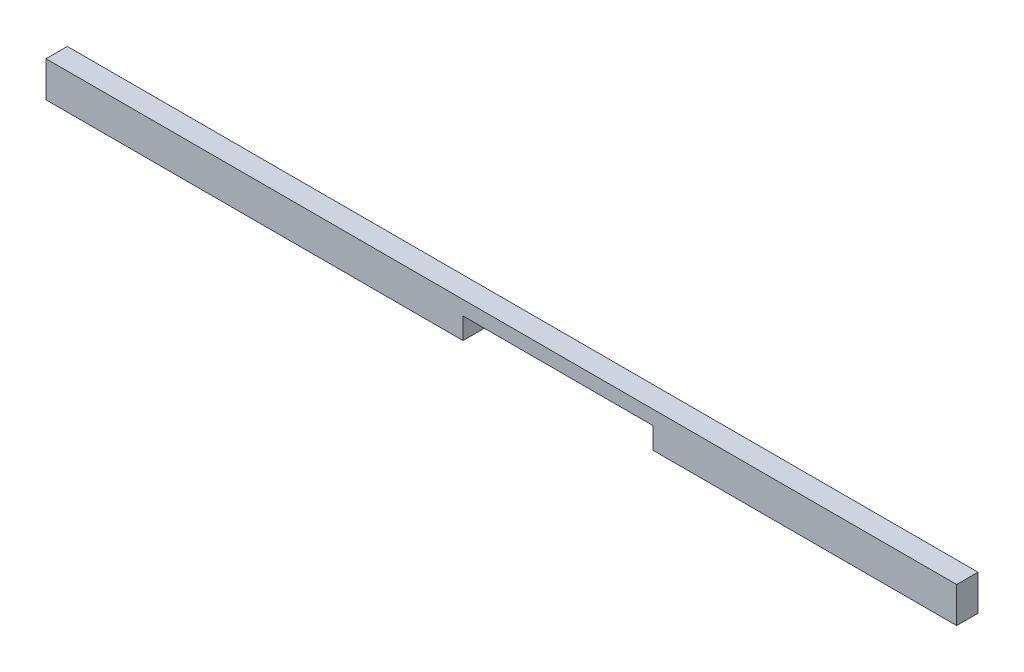
ISO-10303-21;
HEADER;
FILE_DESCRIPTION(('STEP AP214'),'2;1');
FILE_NAME('part.step','',(''),(''),'','','');
FILE_SCHEMA(('AUTOMOTIVE_DESIGN { 1 0 10303 214 1 1 1 1 }'));
ENDSEC;
DATA;
#1=APPLICATION_CONTEXT('core data for automotive mechanical design processes');
#2=APPLICATION_PROTOCOL_DEFINITION('international standard','automotive_design',2000,#1);
#3=PRODUCT_CONTEXT('',#1,'mechanical');
#4=PRODUCT('Part','Part','',(#3));
#5=PRODUCT_RELATED_PRODUCT_CATEGORY('part','',(#4));
#6=PRODUCT_DEFINITION_FORMATION('','',#4);
#7=PRODUCT_DEFINITION_CONTEXT('part definition',#1,'design');
#8=PRODUCT_DEFINITION('design','',#6,#7);
#9=PRODUCT_DEFINITION_SHAPE('','',#8);
#10=(LENGTH_UNIT() NAMED_UNIT(*) SI_UNIT(.MILLI.,.METRE.));
#11=(NAMED_UNIT(*) PLANE_ANGLE_UNIT() SI_UNIT($,.RADIAN.));
#12=(NAMED_UNIT(*) SI_UNIT($,.STERADIAN.) SOLID_ANGLE_UNIT());
#13=UNCERTAINTY_MEASURE_WITH_UNIT(LENGTH_MEASURE(1.E-05),#10,'distance_accuracy_value','');
#14=(GEOMETRIC_REPRESENTATION_CONTEXT(3) GLOBAL_UNCERTAINTY_ASSIGNED_CONTEXT((#13)) GLOBAL_UNIT_ASSIGNED_CONTEXT((#10,
#11,#12)) REPRESENTATION_CONTEXT('',''));
#15=CARTESIAN_POINT('',(0.,0.,0.));
#16=DIRECTION('',(0.,0.,1.));
#17=DIRECTION('',(1.,0.,0.));
#18=AXIS2_PLACEMENT_3D('',#15,#16,#17);
#19=CARTESIAN_POINT('',(0.,0.,0.));
#20=DIRECTION('',(0.,-1.,0.));
#21=DIRECTION('',(0.,0.,-1.));
#22=AXIS2_PLACEMENT_3D('',#19,#20,#21);
#23=PLANE('',#22);
#24=DIRECTION('',(0.,0.,-1.));
#25=VECTOR('',#24,1.);
#26=CARTESIAN_POINT('',(-34.1824934363978,0.,9.525));
#27=LINE('',#26,#25);
#28=CARTESIAN_POINT('',(-34.1824934363978,0.,9.525));
#29=VERTEX_POINT('',#28);
#30=CARTESIAN_POINT('',(-34.1824934363978,0.,-9.525));
#31=VERTEX_POINT('',#30);
#32=EDGE_CURVE('E138',#29,#31,#27,.T.);
#33=ORIENTED_EDGE('',*,*,#32,.F.);
#34=DIRECTION('',(1.,0.,0.));
#35=VECTOR('',#34,1.);
#36=CARTESIAN_POINT('',(-406.4,0.,9.525));
#37=LINE('',#36,#35);
#38=CARTESIAN_POINT('',(-406.4,0.,9.525));
#39=VERTEX_POINT('',#38);
#40=EDGE_CURVE('E130',#39,#29,#37,.T.);
#41=ORIENTED_EDGE('',*,*,#40,.F.);
#42=DIRECTION('',(0.,0.,1.));
#43=VECTOR('',#42,1.);
#44=CARTESIAN_POINT('',(-406.4,0.,9.525));
#45=LINE('',#44,#43);
#46=CARTESIAN_POINT('',(-406.4,0.,-9.525));
#47=VERTEX_POINT('',#46);
#48=EDGE_CURVE('E157',#47,#39,#45,.T.);
#49=ORIENTED_EDGE('',*,*,#48,.F.);
#50=DIRECTION('',(-1.,0.,0.));
#51=VECTOR('',#50,1.);
#52=CARTESIAN_POINT('',(-406.4,0.,-9.525));
#53=LINE('',#52,#51);
#54=EDGE_CURVE('E153',#31,#47,#53,.T.);
#55=ORIENTED_EDGE('',*,*,#54,.F.);
#56=EDGE_LOOP('',(#33,#41,#49,#55));
#57=FACE_BOUND('',#56,.T.);
#58=ADVANCED_FACE('F34',(#57),#23,.T.);
#59=CARTESIAN_POINT('',(406.4,31.75,9.525));
#60=DIRECTION('',(-1.,0.,0.));
#61=DIRECTION('',(0.,0.,1.));
#62=AXIS2_PLACEMENT_3D('',#59,#60,#61);
#63=PLANE('',#62);
#64=DIRECTION('',(0.,0.,-1.));
#65=VECTOR('',#64,1.);
#66=CARTESIAN_POINT('',(406.4,0.,9.525));
#67=LINE('',#66,#65);
#68=CARTESIAN_POINT('',(406.4,0.,9.525));
#69=VERTEX_POINT('',#68);
#70=CARTESIAN_POINT('',(406.4,0.,-9.525));
#71=VERTEX_POINT('',#70);
#72=EDGE_CURVE('E140',#69,#71,#67,.T.);
#73=ORIENTED_EDGE('',*,*,#72,.T.);
#74=DIRECTION('',(0.,-1.,0.));
#75=VECTOR('',#74,1.);
#76=CARTESIAN_POINT('',(406.4,31.75,-9.525));
#77=LINE('',#76,#75);
#78=CARTESIAN_POINT('',(406.4,31.75,-9.525));
#79=VERTEX_POINT('',#78);
#80=EDGE_CURVE('E11',#79,#71,#77,.T.);
#81=ORIENTED_EDGE('',*,*,#80,.F.);
#82=DIRECTION('',(0.,0.,-1.));
#83=VECTOR('',#82,1.);
#84=CARTESIAN_POINT('',(406.4,31.75,9.525));
#85=LINE('',#84,#83);
#86=CARTESIAN_POINT('',(406.4,31.75,9.525));
#87=VERTEX_POINT('',#86);
#88=EDGE_CURVE('E144',#87,#79,#85,.T.);
#89=ORIENTED_EDGE('',*,*,#88,.F.);
#90=DIRECTION('',(0.,-1.,0.));
#91=VECTOR('',#90,1.);
#92=CARTESIAN_POINT('',(406.4,31.75,9.525));
#93=LINE('',#92,#91);
#94=EDGE_CURVE('E150',#87,#69,#93,.T.);
#95=ORIENTED_EDGE('',*,*,#94,.T.);
#96=EDGE_LOOP('',(#73,#81,#89,#95));
#97=FACE_BOUND('',#96,.T.);
#98=ADVANCED_FACE('F36',(#97),#63,.F.);
#99=CARTESIAN_POINT('',(-406.4,31.75,-9.525));
#100=DIRECTION('',(0.,0.,1.));
#101=DIRECTION('',(1.,0.,0.));
#102=AXIS2_PLACEMENT_3D('',#99,#100,#101);
#103=PLANE('',#102);
#104=DIRECTION('',(1.,0.,0.));
#105=VECTOR('',#104,1.);
#106=CARTESIAN_POINT('',(-34.1824934363978,19.05,-9.525));
#107=LINE('',#106,#105);
#108=CARTESIAN_POINT('',(-34.1824934363978,19.05,-9.525));
#109=VERTEX_POINT('',#108);
#110=CARTESIAN_POINT('',(135.206139415608,19.05,-9.525));
#111=VERTEX_POINT('',#110);
#112=EDGE_CURVE('E132',#109,#111,#107,.T.);
#113=ORIENTED_EDGE('',*,*,#112,.F.);
#114=DIRECTION('',(0.,1.,0.));
#115=VECTOR('',#114,1.);
#116=CARTESIAN_POINT('',(-34.1824934363978,0.,-9.525));
#117=LINE('',#116,#115);
#118=EDGE_CURVE('E114',#31,#109,#117,.T.);
#119=ORIENTED_EDGE('',*,*,#118,.F.);
#120=ORIENTED_EDGE('',*,*,#54,.T.);
#121=DIRECTION('',(0.,-1.,0.));
#122=VECTOR('',#121,1.);
#123=CARTESIAN_POINT('',(-406.4,31.75,-9.525));
#124=LINE('',#123,#122);
#125=CARTESIAN_POINT('',(-406.4,31.75,-9.525));
#126=VERTEX_POINT('',#125);
#127=EDGE_CURVE('E42',#126,#47,#124,.T.);
#128=ORIENTED_EDGE('',*,*,#127,.F.);
#129=DIRECTION('',(-1.,0.,0.));
#130=VECTOR('',#129,1.);
#131=CARTESIAN_POINT('',(-406.4,31.75,-9.525));
#132=LINE('',#131,#130);
#133=EDGE_CURVE('E86',#79,#126,#132,.T.);
#134=ORIENTED_EDGE('',*,*,#133,.F.);
#135=ORIENTED_EDGE('',*,*,#80,.T.);
#136=CARTESIAN_POINT('',(135.206139415608,0.,-9.525));
#137=VERTEX_POINT('',#136);
#138=EDGE_CURVE('E154',#71,#137,#53,.T.);
#139=ORIENTED_EDGE('',*,*,#138,.T.);
#140=DIRECTION('',(0.,-1.,0.));
#141=VECTOR('',#140,1.);
#142=CARTESIAN_POINT('',(135.206139415608,19.05,-9.525));
#143=LINE('',#142,#141);
#144=EDGE_CURVE('E49',#111,#137,#143,.T.);
#145=ORIENTED_EDGE('',*,*,#144,.F.);
#146=EDGE_LOOP('',(#113,#119,#120,#128,#134,#135,#139,#145));
#147=FACE_BOUND('',#146,.T.);
#148=ADVANCED_FACE('F170',(#147),#103,.F.);
#149=CARTESIAN_POINT('',(-406.4,31.75,9.525));
#150=DIRECTION('',(1.,0.,0.));
#151=DIRECTION('',(0.,0.,-1.));
#152=AXIS2_PLACEMENT_3D('',#149,#150,#151);
#153=PLANE('',#152);
#154=ORIENTED_EDGE('',*,*,#48,.T.);
#155=DIRECTION('',(0.,-1.,0.));
#156=VECTOR('',#155,1.);
#157=CARTESIAN_POINT('',(-406.4,31.75,9.525));
#158=LINE('',#157,#156);
#159=CARTESIAN_POINT('',(-406.4,31.75,9.525));
#160=VERTEX_POINT('',#159);
#161=EDGE_CURVE('E161',#160,#39,#158,.T.);
#162=ORIENTED_EDGE('',*,*,#161,.F.);
#163=DIRECTION('',(0.,0.,1.));
#164=VECTOR('',#163,1.);
#165=CARTESIAN_POINT('',(-406.4,31.75,9.525));
#166=LINE('',#165,#164);
#167=EDGE_CURVE('E147',#126,#160,#166,.T.);
#168=ORIENTED_EDGE('',*,*,#167,.F.);
#169=ORIENTED_EDGE('',*,*,#127,.T.);
#170=EDGE_LOOP('',(#154,#162,#168,#169));
#171=FACE_BOUND('',#170,.T.);
#172=ADVANCED_FACE('F166',(#171),#153,.F.);
#173=CARTESIAN_POINT('',(-406.4,31.75,9.525));
#174=DIRECTION('',(0.,0.,-1.));
#175=DIRECTION('',(-1.,0.,0.));
#176=AXIS2_PLACEMENT_3D('',#173,#174,#175);
#177=PLANE('',#176);
#178=ORIENTED_EDGE('',*,*,#40,.T.);
#179=DIRECTION('',(0.,1.,0.));
#180=VECTOR('',#179,1.);
#181=CARTESIAN_POINT('',(-34.1824934363978,0.,9.525));
#182=LINE('',#181,#180);
#183=CARTESIAN_POINT('',(-34.1824934363978,19.05,9.525));
#184=VERTEX_POINT('',#183);
#185=EDGE_CURVE('E111',#29,#184,#182,.T.);
#186=ORIENTED_EDGE('',*,*,#185,.T.);
#187=DIRECTION('',(1.,0.,0.));
#188=VECTOR('',#187,1.);
#189=CARTESIAN_POINT('',(-34.1824934363978,19.05,9.525));
#190=LINE('',#189,#188);
#191=CARTESIAN_POINT('',(135.206139415608,19.05,9.525));
#192=VERTEX_POINT('',#191);
#193=EDGE_CURVE('E122',#184,#192,#190,.T.);
#194=ORIENTED_EDGE('',*,*,#193,.T.);
#195=DIRECTION('',(0.,-1.,0.));
#196=VECTOR('',#195,1.);
#197=CARTESIAN_POINT('',(135.206139415608,19.05,9.525));
#198=LINE('',#197,#196);
#199=CARTESIAN_POINT('',(135.206139415608,0.,9.525));
#200=VERTEX_POINT('',#199);
#201=EDGE_CURVE('E119',#192,#200,#198,.T.);
#202=ORIENTED_EDGE('',*,*,#201,.T.);
#203=EDGE_CURVE('E79',#200,#69,#37,.T.);
#204=ORIENTED_EDGE('',*,*,#203,.T.);
#205=ORIENTED_EDGE('',*,*,#94,.F.);
#206=DIRECTION('',(1.,0.,0.));
#207=VECTOR('',#206,1.);
#208=CARTESIAN_POINT('',(-406.4,31.75,9.525));
#209=LINE('',#208,#207);
#210=EDGE_CURVE('E58',#160,#87,#209,.T.);
#211=ORIENTED_EDGE('',*,*,#210,.F.);
#212=ORIENTED_EDGE('',*,*,#161,.T.);
#213=EDGE_LOOP('',(#178,#186,#194,#202,#204,#205,#211,#212));
#214=FACE_BOUND('',#213,.T.);
#215=ADVANCED_FACE('F127',(#214),#177,.F.);
#216=CARTESIAN_POINT('',(0.,31.75,0.));
#217=DIRECTION('',(0.,-1.,0.));
#218=DIRECTION('',(0.,0.,-1.));
#219=AXIS2_PLACEMENT_3D('',#216,#217,#218);
#220=PLANE('',#219);
#221=ORIENTED_EDGE('',*,*,#88,.T.);
#222=ORIENTED_EDGE('',*,*,#133,.T.);
#223=ORIENTED_EDGE('',*,*,#167,.T.);
#224=ORIENTED_EDGE('',*,*,#210,.T.);
#225=EDGE_LOOP('',(#221,#222,#223,#224));
#226=FACE_BOUND('',#225,.T.);
#227=ADVANCED_FACE('F193',(#226),#220,.F.);
#228=DIRECTION('',(0.,0.,-1.));
#229=VECTOR('',#228,1.);
#230=CARTESIAN_POINT('',(135.206139415608,0.,9.525));
#231=LINE('',#230,#229);
#232=EDGE_CURVE('E141',#200,#137,#231,.T.);
#233=ORIENTED_EDGE('',*,*,#232,.T.);
#234=ORIENTED_EDGE('',*,*,#138,.F.);
#235=ORIENTED_EDGE('',*,*,#72,.F.);
#236=ORIENTED_EDGE('',*,*,#203,.F.);
#237=EDGE_LOOP('',(#233,#234,#235,#236));
#238=FACE_BOUND('',#237,.T.);
#239=ADVANCED_FACE('F174',(#238),#23,.T.);
#240=CARTESIAN_POINT('',(-34.1824934363978,0.,9.525));
#241=DIRECTION('',(-1.,0.,0.));
#242=DIRECTION('',(0.,0.,1.));
#243=AXIS2_PLACEMENT_3D('',#240,#241,#242);
#244=PLANE('',#243);
#245=ORIENTED_EDGE('',*,*,#118,.T.);
#246=DIRECTION('',(0.,0.,-1.));
#247=VECTOR('',#246,1.);
#248=CARTESIAN_POINT('',(-34.1824934363978,19.05,9.525));
#249=LINE('',#248,#247);
#250=EDGE_CURVE('E107',#184,#109,#249,.T.);
#251=ORIENTED_EDGE('',*,*,#250,.F.);
#252=ORIENTED_EDGE('',*,*,#185,.F.);
#253=ORIENTED_EDGE('',*,*,#32,.T.);
#254=EDGE_LOOP('',(#245,#251,#252,#253));
#255=FACE_BOUND('',#254,.T.);
#256=ADVANCED_FACE('F109',(#255),#244,.F.);
#257=CARTESIAN_POINT('',(135.206139415608,19.05,9.525));
#258=DIRECTION('',(1.,0.,0.));
#259=DIRECTION('',(0.,0.,-1.));
#260=AXIS2_PLACEMENT_3D('',#257,#258,#259);
#261=PLANE('',#260);
#262=ORIENTED_EDGE('',*,*,#144,.T.);
#263=ORIENTED_EDGE('',*,*,#232,.F.);
#264=ORIENTED_EDGE('',*,*,#201,.F.);
#265=DIRECTION('',(0.,0.,-1.));
#266=VECTOR('',#265,1.);
#267=CARTESIAN_POINT('',(135.206139415608,19.05,9.525));
#268=LINE('',#267,#266);
#269=EDGE_CURVE('E118',#192,#111,#268,.T.);
#270=ORIENTED_EDGE('',*,*,#269,.T.);
#271=EDGE_LOOP('',(#262,#263,#264,#270));
#272=FACE_BOUND('',#271,.T.);
#273=ADVANCED_FACE('F175',(#272),#261,.F.);
#274=CARTESIAN_POINT('',(-34.1824934363978,19.05,9.525));
#275=DIRECTION('',(0.,1.,0.));
#276=DIRECTION('',(0.,0.,1.));
#277=AXIS2_PLACEMENT_3D('',#274,#275,#276);
#278=PLANE('',#277);
#279=ORIENTED_EDGE('',*,*,#112,.T.);
#280=ORIENTED_EDGE('',*,*,#269,.F.);
#281=ORIENTED_EDGE('',*,*,#193,.F.);
#282=ORIENTED_EDGE('',*,*,#250,.T.);
#283=EDGE_LOOP('',(#279,#280,#281,#282));
#284=FACE_BOUND('',#283,.T.);
#285=ADVANCED_FACE('F123',(#284),#278,.F.);
#286=CLOSED_SHELL('',(#58,#98,#148,#172,#215,#227,#239,#256,#273,#285));
#287=MANIFOLD_SOLID_BREP('B2',#286);
#288=ADVANCED_BREP_SHAPE_REPRESENTATION('',(#18,#287),#14);
#289=SHAPE_DEFINITION_REPRESENTATION(#9,#288);
ENDSEC;
END-ISO-10303-21;
